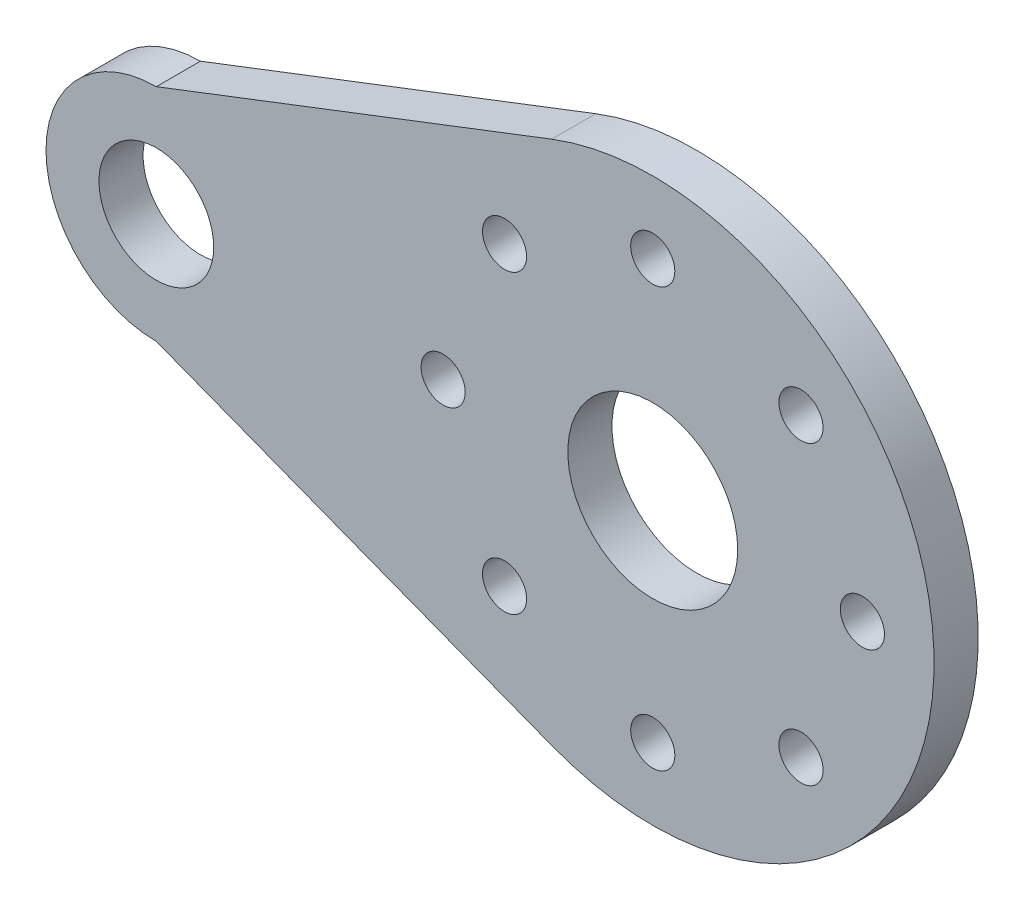
ISO-10303-21;
HEADER;
FILE_DESCRIPTION(('STEP AP214'),'2;1');
FILE_NAME('part.step','',(''),(''),'','','');
FILE_SCHEMA(('AUTOMOTIVE_DESIGN { 1 0 10303 214 1 1 1 1 }'));
ENDSEC;
DATA;
#1=APPLICATION_CONTEXT('core data for automotive mechanical design processes');
#2=APPLICATION_PROTOCOL_DEFINITION('international standard','automotive_design',2000,#1);
#3=PRODUCT_CONTEXT('',#1,'mechanical');
#4=PRODUCT('Part','Part','',(#3));
#5=PRODUCT_RELATED_PRODUCT_CATEGORY('part','',(#4));
#6=PRODUCT_DEFINITION_FORMATION('','',#4);
#7=PRODUCT_DEFINITION_CONTEXT('part definition',#1,'design');
#8=PRODUCT_DEFINITION('design','',#6,#7);
#9=PRODUCT_DEFINITION_SHAPE('','',#8);
#10=(LENGTH_UNIT() NAMED_UNIT(*) SI_UNIT(.MILLI.,.METRE.));
#11=(NAMED_UNIT(*) PLANE_ANGLE_UNIT() SI_UNIT($,.RADIAN.));
#12=(NAMED_UNIT(*) SI_UNIT($,.STERADIAN.) SOLID_ANGLE_UNIT());
#13=UNCERTAINTY_MEASURE_WITH_UNIT(LENGTH_MEASURE(1.E-05),#10,'distance_accuracy_value','');
#14=(GEOMETRIC_REPRESENTATION_CONTEXT(3) GLOBAL_UNCERTAINTY_ASSIGNED_CONTEXT((#13)) GLOBAL_UNIT_ASSIGNED_CONTEXT((#10,
#11,#12)) REPRESENTATION_CONTEXT('',''));
#15=CARTESIAN_POINT('',(0.,0.,0.));
#16=DIRECTION('',(0.,0.,1.));
#17=DIRECTION('',(1.,0.,0.));
#18=AXIS2_PLACEMENT_3D('',#15,#16,#17);
#19=CARTESIAN_POINT('',(95.4647726056997,-16.6382713176005,4.));
#20=DIRECTION('',(0.,0.,-1.));
#21=DIRECTION('',(-1.,0.,0.));
#22=AXIS2_PLACEMENT_3D('',#19,#20,#21);
#23=PLANE('',#22);
#24=CARTESIAN_POINT('',(95.4647726056997,-16.6382713176005,4.));
#25=DIRECTION('',(0.,0.,1.));
#26=DIRECTION('',(-1.,0.,0.));
#27=AXIS2_PLACEMENT_3D('',#24,#25,#26);
#28=CIRCLE('',#27,9.99999999999999);
#29=CARTESIAN_POINT('',(95.4647726056997,-6.63827131760054,4.));
#30=VERTEX_POINT('',#29);
#31=CARTESIAN_POINT('',(95.4647726056997,-26.6382713176005,4.));
#32=VERTEX_POINT('',#31);
#33=EDGE_CURVE('E92',#30,#32,#28,.T.);
#34=ORIENTED_EDGE('',*,*,#33,.T.);
#35=DIRECTION('',(0.9332288586066,-0.359282475865194,0.));
#36=VECTOR('',#35,1.);
#37=CARTESIAN_POINT('',(95.4647726056997,-26.6382713176005,4.));
#38=LINE('',#37,#36);
#39=CARTESIAN_POINT('',(131.303069471137,-40.4356072120686,4.));
#40=VERTEX_POINT('',#39);
#41=EDGE_CURVE('E87',#32,#40,#38,.T.);
#42=ORIENTED_EDGE('',*,*,#41,.T.);
#43=CARTESIAN_POINT('',(140.4647726057,-16.6382713176005,4.));
#44=DIRECTION('',(0.,0.,1.));
#45=DIRECTION('',(-1.,0.,0.));
#46=AXIS2_PLACEMENT_3D('',#43,#44,#45);
#47=CIRCLE('',#46,25.4999999999998);
#48=CARTESIAN_POINT('',(131.303069471137,7.15906457686749,4.));
#49=VERTEX_POINT('',#48);
#50=EDGE_CURVE('E90',#40,#49,#47,.T.);
#51=ORIENTED_EDGE('',*,*,#50,.T.);
#52=DIRECTION('',(-0.933228858606599,-0.359282475865194,0.));
#53=VECTOR('',#52,1.);
#54=CARTESIAN_POINT('',(95.4647726056997,-6.63827131760054,4.));
#55=LINE('',#54,#53);
#56=EDGE_CURVE('E57',#49,#30,#55,.T.);
#57=ORIENTED_EDGE('',*,*,#56,.T.);
#58=EDGE_LOOP('',(#34,#42,#51,#57));
#59=FACE_BOUND('',#58,.T.);
#60=CARTESIAN_POINT('',(140.4647726057,-35.6382713175993,4.));
#61=DIRECTION('',(0.,0.,1.));
#62=DIRECTION('',(1.,0.,0.));
#63=AXIS2_PLACEMENT_3D('',#60,#61,#62);
#64=CIRCLE('',#63,1.99999999999848);
#65=CARTESIAN_POINT('',(142.464772605698,-35.6382713175993,4.));
#66=VERTEX_POINT('',#65);
#67=EDGE_CURVE('E112',#66,#66,#64,.T.);
#68=ORIENTED_EDGE('',*,*,#67,.F.);
#69=EDGE_LOOP('',(#68));
#70=FACE_BOUND('',#69,.T.);
#71=CARTESIAN_POINT('',(140.4647726057,-16.6382713176005,4.));
#72=DIRECTION('',(0.,0.,1.));
#73=DIRECTION('',(1.,0.,0.));
#74=AXIS2_PLACEMENT_3D('',#71,#72,#73);
#75=CIRCLE('',#74,7.7);
#76=CARTESIAN_POINT('',(148.1647726057,-16.6382713176005,4.));
#77=VERTEX_POINT('',#76);
#78=EDGE_CURVE('E134',#77,#77,#75,.T.);
#79=ORIENTED_EDGE('',*,*,#78,.F.);
#80=EDGE_LOOP('',(#79));
#81=FACE_BOUND('',#80,.T.);
#82=CARTESIAN_POINT('',(127.029743763154,-30.0733001601467,4.));
#83=DIRECTION('',(0.,0.,1.));
#84=DIRECTION('',(1.,0.,0.));
#85=AXIS2_PLACEMENT_3D('',#82,#83,#84);
#86=CIRCLE('',#85,1.99999999999913);
#87=CARTESIAN_POINT('',(129.029743763153,-30.0733001601467,4.));
#88=VERTEX_POINT('',#87);
#89=EDGE_CURVE('E142',#88,#88,#86,.T.);
#90=ORIENTED_EDGE('',*,*,#89,.F.);
#91=EDGE_LOOP('',(#90));
#92=FACE_BOUND('',#91,.T.);
#93=CARTESIAN_POINT('',(121.464772605697,-16.6382713176019,4.));
#94=DIRECTION('',(0.,0.,1.));
#95=DIRECTION('',(1.,0.,0.));
#96=AXIS2_PLACEMENT_3D('',#93,#94,#95);
#97=CIRCLE('',#96,1.99999999999909);
#98=CARTESIAN_POINT('',(123.464772605696,-16.6382713176019,4.));
#99=VERTEX_POINT('',#98);
#100=EDGE_CURVE('E150',#99,#99,#97,.T.);
#101=ORIENTED_EDGE('',*,*,#100,.F.);
#102=EDGE_LOOP('',(#101));
#103=FACE_BOUND('',#102,.T.);
#104=CARTESIAN_POINT('',(127.029743763152,-3.20324247505635,4.));
#105=DIRECTION('',(0.,0.,1.));
#106=DIRECTION('',(1.,0.,0.));
#107=AXIS2_PLACEMENT_3D('',#104,#105,#106);
#108=CIRCLE('',#107,1.99999999999905);
#109=CARTESIAN_POINT('',(129.029743763151,-3.20324247505635,4.));
#110=VERTEX_POINT('',#109);
#111=EDGE_CURVE('E158',#110,#110,#108,.T.);
#112=ORIENTED_EDGE('',*,*,#111,.F.);
#113=EDGE_LOOP('',(#112));
#114=FACE_BOUND('',#113,.T.);
#115=CARTESIAN_POINT('',(95.4647726056997,-16.6382713176005,4.));
#116=DIRECTION('',(0.,0.,1.));
#117=DIRECTION('',(1.,0.,0.));
#118=AXIS2_PLACEMENT_3D('',#115,#116,#117);
#119=CIRCLE('',#118,5.19999999999999);
#120=CARTESIAN_POINT('',(100.6647726057,-16.6382713176005,4.));
#121=VERTEX_POINT('',#120);
#122=EDGE_CURVE('E166',#121,#121,#119,.T.);
#123=ORIENTED_EDGE('',*,*,#122,.F.);
#124=EDGE_LOOP('',(#123));
#125=FACE_BOUND('',#124,.T.);
#126=CARTESIAN_POINT('',(140.464772605697,2.36172868240044,4.));
#127=DIRECTION('',(0.,0.,1.));
#128=DIRECTION('',(1.,0.,0.));
#129=AXIS2_PLACEMENT_3D('',#126,#127,#128);
#130=CIRCLE('',#129,1.99999999999901);
#131=CARTESIAN_POINT('',(142.464772605696,2.36172868240044,4.));
#132=VERTEX_POINT('',#131);
#133=EDGE_CURVE('E174',#132,#132,#130,.T.);
#134=ORIENTED_EDGE('',*,*,#133,.F.);
#135=EDGE_LOOP('',(#134));
#136=FACE_BOUND('',#135,.T.);
#137=CARTESIAN_POINT('',(153.899801448243,-3.20324247505459,4.));
#138=DIRECTION('',(0.,0.,1.));
#139=DIRECTION('',(1.,0.,0.));
#140=AXIS2_PLACEMENT_3D('',#137,#138,#139);
#141=CIRCLE('',#140,1.99999999999897);
#142=CARTESIAN_POINT('',(155.899801448242,-3.20324247505459,4.));
#143=VERTEX_POINT('',#142);
#144=EDGE_CURVE('E182',#143,#143,#141,.T.);
#145=ORIENTED_EDGE('',*,*,#144,.F.);
#146=EDGE_LOOP('',(#145));
#147=FACE_BOUND('',#146,.T.);
#148=CARTESIAN_POINT('',(159.464772605699,-16.6382713175994,4.));
#149=DIRECTION('',(0.,0.,1.));
#150=DIRECTION('',(1.,0.,0.));
#151=AXIS2_PLACEMENT_3D('',#148,#149,#150);
#152=CIRCLE('',#151,1.99999999999895);
#153=CARTESIAN_POINT('',(161.464772605698,-16.6382713175994,4.));
#154=VERTEX_POINT('',#153);
#155=EDGE_CURVE('E190',#154,#154,#152,.T.);
#156=ORIENTED_EDGE('',*,*,#155,.F.);
#157=EDGE_LOOP('',(#156));
#158=FACE_BOUND('',#157,.T.);
#159=CARTESIAN_POINT('',(153.899801448244,-30.0733001601449,4.));
#160=DIRECTION('',(0.,0.,1.));
#161=DIRECTION('',(1.,0.,0.));
#162=AXIS2_PLACEMENT_3D('',#159,#160,#161);
#163=CIRCLE('',#162,1.99999999999894);
#164=CARTESIAN_POINT('',(155.899801448243,-30.0733001601449,4.));
#165=VERTEX_POINT('',#164);
#166=EDGE_CURVE('E198',#165,#165,#163,.T.);
#167=ORIENTED_EDGE('',*,*,#166,.F.);
#168=EDGE_LOOP('',(#167));
#169=FACE_BOUND('',#168,.T.);
#170=ADVANCED_FACE('F39',(#59,#70,#81,#92,#103,#114,#125,#136,#147,#158,#169),#23,.F.);
#171=CARTESIAN_POINT('',(95.4647726056997,-16.6382713176005,0.));
#172=DIRECTION('',(0.,0.,-1.));
#173=DIRECTION('',(-1.,0.,0.));
#174=AXIS2_PLACEMENT_3D('',#171,#172,#173);
#175=PLANE('',#174);
#176=CARTESIAN_POINT('',(159.464772605699,-16.6382713175994,0.));
#177=DIRECTION('',(0.,0.,1.));
#178=DIRECTION('',(1.,0.,0.));
#179=AXIS2_PLACEMENT_3D('',#176,#177,#178);
#180=CIRCLE('',#179,1.99999999999895);
#181=CARTESIAN_POINT('',(161.464772605698,-16.6382713175994,0.));
#182=VERTEX_POINT('',#181);
#183=EDGE_CURVE('E194',#182,#182,#180,.T.);
#184=ORIENTED_EDGE('',*,*,#183,.T.);
#185=EDGE_LOOP('',(#184));
#186=FACE_BOUND('',#185,.T.);
#187=CARTESIAN_POINT('',(140.464772605697,2.36172868240044,0.));
#188=DIRECTION('',(0.,0.,1.));
#189=DIRECTION('',(1.,0.,0.));
#190=AXIS2_PLACEMENT_3D('',#187,#188,#189);
#191=CIRCLE('',#190,1.99999999999901);
#192=CARTESIAN_POINT('',(142.464772605696,2.36172868240044,0.));
#193=VERTEX_POINT('',#192);
#194=EDGE_CURVE('E178',#193,#193,#191,.T.);
#195=ORIENTED_EDGE('',*,*,#194,.T.);
#196=EDGE_LOOP('',(#195));
#197=FACE_BOUND('',#196,.T.);
#198=CARTESIAN_POINT('',(127.029743763152,-3.20324247505635,0.));
#199=DIRECTION('',(0.,0.,1.));
#200=DIRECTION('',(1.,0.,0.));
#201=AXIS2_PLACEMENT_3D('',#198,#199,#200);
#202=CIRCLE('',#201,1.99999999999905);
#203=CARTESIAN_POINT('',(129.029743763151,-3.20324247505635,0.));
#204=VERTEX_POINT('',#203);
#205=EDGE_CURVE('E162',#204,#204,#202,.T.);
#206=ORIENTED_EDGE('',*,*,#205,.T.);
#207=EDGE_LOOP('',(#206));
#208=FACE_BOUND('',#207,.T.);
#209=CARTESIAN_POINT('',(127.029743763154,-30.0733001601467,0.));
#210=DIRECTION('',(0.,0.,1.));
#211=DIRECTION('',(1.,0.,0.));
#212=AXIS2_PLACEMENT_3D('',#209,#210,#211);
#213=CIRCLE('',#212,1.99999999999913);
#214=CARTESIAN_POINT('',(129.029743763153,-30.0733001601467,0.));
#215=VERTEX_POINT('',#214);
#216=EDGE_CURVE('E146',#215,#215,#213,.T.);
#217=ORIENTED_EDGE('',*,*,#216,.T.);
#218=EDGE_LOOP('',(#217));
#219=FACE_BOUND('',#218,.T.);
#220=CARTESIAN_POINT('',(140.4647726057,-35.6382713175993,0.));
#221=DIRECTION('',(0.,0.,1.));
#222=DIRECTION('',(1.,0.,0.));
#223=AXIS2_PLACEMENT_3D('',#220,#221,#222);
#224=CIRCLE('',#223,1.99999999999848);
#225=CARTESIAN_POINT('',(142.464772605698,-35.6382713175993,0.));
#226=VERTEX_POINT('',#225);
#227=EDGE_CURVE('E130',#226,#226,#224,.T.);
#228=ORIENTED_EDGE('',*,*,#227,.T.);
#229=EDGE_LOOP('',(#228));
#230=FACE_BOUND('',#229,.T.);
#231=CARTESIAN_POINT('',(95.4647726056997,-16.6382713176005,0.));
#232=DIRECTION('',(0.,0.,1.));
#233=DIRECTION('',(-1.,0.,0.));
#234=AXIS2_PLACEMENT_3D('',#231,#232,#233);
#235=CIRCLE('',#234,9.99999999999999);
#236=CARTESIAN_POINT('',(95.4647726056997,-6.63827131760054,0.));
#237=VERTEX_POINT('',#236);
#238=CARTESIAN_POINT('',(95.4647726056997,-26.6382713176005,0.));
#239=VERTEX_POINT('',#238);
#240=EDGE_CURVE('E108',#237,#239,#235,.T.);
#241=ORIENTED_EDGE('',*,*,#240,.F.);
#242=DIRECTION('',(-0.933228858606599,-0.359282475865194,0.));
#243=VECTOR('',#242,1.);
#244=CARTESIAN_POINT('',(95.4647726056997,-6.63827131760054,0.));
#245=LINE('',#244,#243);
#246=CARTESIAN_POINT('',(131.303069471137,7.15906457686749,0.));
#247=VERTEX_POINT('',#246);
#248=EDGE_CURVE('E80',#247,#237,#245,.T.);
#249=ORIENTED_EDGE('',*,*,#248,.F.);
#250=CARTESIAN_POINT('',(140.4647726057,-16.6382713176005,0.));
#251=DIRECTION('',(0.,0.,1.));
#252=DIRECTION('',(-1.,0.,0.));
#253=AXIS2_PLACEMENT_3D('',#250,#251,#252);
#254=CIRCLE('',#253,25.4999999999998);
#255=CARTESIAN_POINT('',(131.303069471137,-40.4356072120686,0.));
#256=VERTEX_POINT('',#255);
#257=EDGE_CURVE('E74',#256,#247,#254,.T.);
#258=ORIENTED_EDGE('',*,*,#257,.F.);
#259=DIRECTION('',(0.9332288586066,-0.359282475865194,0.));
#260=VECTOR('',#259,1.);
#261=CARTESIAN_POINT('',(95.4647726056997,-26.6382713176005,0.));
#262=LINE('',#261,#260);
#263=EDGE_CURVE('E97',#239,#256,#262,.T.);
#264=ORIENTED_EDGE('',*,*,#263,.F.);
#265=EDGE_LOOP('',(#241,#249,#258,#264));
#266=FACE_BOUND('',#265,.T.);
#267=CARTESIAN_POINT('',(140.4647726057,-16.6382713176005,0.));
#268=DIRECTION('',(0.,0.,1.));
#269=DIRECTION('',(1.,0.,0.));
#270=AXIS2_PLACEMENT_3D('',#267,#268,#269);
#271=CIRCLE('',#270,7.7);
#272=CARTESIAN_POINT('',(148.1647726057,-16.6382713176005,0.));
#273=VERTEX_POINT('',#272);
#274=EDGE_CURVE('E138',#273,#273,#271,.T.);
#275=ORIENTED_EDGE('',*,*,#274,.T.);
#276=EDGE_LOOP('',(#275));
#277=FACE_BOUND('',#276,.T.);
#278=CARTESIAN_POINT('',(121.464772605697,-16.6382713176019,0.));
#279=DIRECTION('',(0.,0.,1.));
#280=DIRECTION('',(1.,0.,0.));
#281=AXIS2_PLACEMENT_3D('',#278,#279,#280);
#282=CIRCLE('',#281,1.99999999999909);
#283=CARTESIAN_POINT('',(123.464772605696,-16.6382713176019,0.));
#284=VERTEX_POINT('',#283);
#285=EDGE_CURVE('E154',#284,#284,#282,.T.);
#286=ORIENTED_EDGE('',*,*,#285,.T.);
#287=EDGE_LOOP('',(#286));
#288=FACE_BOUND('',#287,.T.);
#289=CARTESIAN_POINT('',(95.4647726056997,-16.6382713176005,0.));
#290=DIRECTION('',(0.,0.,1.));
#291=DIRECTION('',(1.,0.,0.));
#292=AXIS2_PLACEMENT_3D('',#289,#290,#291);
#293=CIRCLE('',#292,5.19999999999999);
#294=CARTESIAN_POINT('',(100.6647726057,-16.6382713176005,0.));
#295=VERTEX_POINT('',#294);
#296=EDGE_CURVE('E170',#295,#295,#293,.T.);
#297=ORIENTED_EDGE('',*,*,#296,.T.);
#298=EDGE_LOOP('',(#297));
#299=FACE_BOUND('',#298,.T.);
#300=CARTESIAN_POINT('',(153.899801448243,-3.20324247505459,0.));
#301=DIRECTION('',(0.,0.,1.));
#302=DIRECTION('',(1.,0.,0.));
#303=AXIS2_PLACEMENT_3D('',#300,#301,#302);
#304=CIRCLE('',#303,1.99999999999897);
#305=CARTESIAN_POINT('',(155.899801448242,-3.20324247505459,0.));
#306=VERTEX_POINT('',#305);
#307=EDGE_CURVE('E186',#306,#306,#304,.T.);
#308=ORIENTED_EDGE('',*,*,#307,.T.);
#309=EDGE_LOOP('',(#308));
#310=FACE_BOUND('',#309,.T.);
#311=CARTESIAN_POINT('',(153.899801448244,-30.0733001601449,0.));
#312=DIRECTION('',(0.,0.,1.));
#313=DIRECTION('',(1.,0.,0.));
#314=AXIS2_PLACEMENT_3D('',#311,#312,#313);
#315=CIRCLE('',#314,1.99999999999894);
#316=CARTESIAN_POINT('',(155.899801448243,-30.0733001601449,0.));
#317=VERTEX_POINT('',#316);
#318=EDGE_CURVE('E202',#317,#317,#315,.T.);
#319=ORIENTED_EDGE('',*,*,#318,.T.);
#320=EDGE_LOOP('',(#319));
#321=FACE_BOUND('',#320,.T.);
#322=ADVANCED_FACE('F125',(#186,#197,#208,#219,#230,#266,#277,#288,#299,#310,#321),#175,.T.);
#323=CARTESIAN_POINT('',(95.4647726056997,-16.6382713176005,4.));
#324=DIRECTION('',(0.,0.,-1.));
#325=DIRECTION('',(-1.,0.,0.));
#326=AXIS2_PLACEMENT_3D('',#323,#324,#325);
#327=CYLINDRICAL_SURFACE('',#326,9.99999999999999);
#328=ORIENTED_EDGE('',*,*,#240,.T.);
#329=DIRECTION('',(0.,0.,-1.));
#330=VECTOR('',#329,1.);
#331=CARTESIAN_POINT('',(95.4647726056997,-26.6382713176005,4.));
#332=LINE('',#331,#330);
#333=EDGE_CURVE('E11',#32,#239,#332,.T.);
#334=ORIENTED_EDGE('',*,*,#333,.F.);
#335=ORIENTED_EDGE('',*,*,#33,.F.);
#336=DIRECTION('',(0.,0.,-1.));
#337=VECTOR('',#336,1.);
#338=CARTESIAN_POINT('',(95.4647726056997,-6.63827131760054,4.));
#339=LINE('',#338,#337);
#340=EDGE_CURVE('E104',#30,#237,#339,.T.);
#341=ORIENTED_EDGE('',*,*,#340,.T.);
#342=EDGE_LOOP('',(#328,#334,#335,#341));
#343=FACE_BOUND('',#342,.T.);
#344=ADVANCED_FACE('F41',(#343),#327,.T.);
#345=CARTESIAN_POINT('',(95.4647726056997,-26.6382713176005,4.));
#346=DIRECTION('',(0.359282475865194,0.933228858606599,0.));
#347=DIRECTION('',(-0.9332288586066,0.359282475865194,0.));
#348=AXIS2_PLACEMENT_3D('',#345,#346,#347);
#349=PLANE('',#348);
#350=ORIENTED_EDGE('',*,*,#263,.T.);
#351=DIRECTION('',(0.,0.,-1.));
#352=VECTOR('',#351,1.);
#353=CARTESIAN_POINT('',(131.303069471137,-40.4356072120686,4.));
#354=LINE('',#353,#352);
#355=EDGE_CURVE('E49',#40,#256,#354,.T.);
#356=ORIENTED_EDGE('',*,*,#355,.F.);
#357=ORIENTED_EDGE('',*,*,#41,.F.);
#358=ORIENTED_EDGE('',*,*,#333,.T.);
#359=EDGE_LOOP('',(#350,#356,#357,#358));
#360=FACE_BOUND('',#359,.T.);
#361=ADVANCED_FACE('F96',(#360),#349,.F.);
#362=CARTESIAN_POINT('',(140.4647726057,-16.6382713176005,4.));
#363=DIRECTION('',(0.,0.,-1.));
#364=DIRECTION('',(-1.,0.,0.));
#365=AXIS2_PLACEMENT_3D('',#362,#363,#364);
#366=CYLINDRICAL_SURFACE('',#365,25.4999999999998);
#367=ORIENTED_EDGE('',*,*,#257,.T.);
#368=DIRECTION('',(0.,0.,-1.));
#369=VECTOR('',#368,1.);
#370=CARTESIAN_POINT('',(131.303069471137,7.15906457686749,4.));
#371=LINE('',#370,#369);
#372=EDGE_CURVE('E99',#49,#247,#371,.T.);
#373=ORIENTED_EDGE('',*,*,#372,.F.);
#374=ORIENTED_EDGE('',*,*,#50,.F.);
#375=ORIENTED_EDGE('',*,*,#355,.T.);
#376=EDGE_LOOP('',(#367,#373,#374,#375));
#377=FACE_BOUND('',#376,.T.);
#378=ADVANCED_FACE('F100',(#377),#366,.T.);
#379=CARTESIAN_POINT('',(95.4647726056997,-6.63827131760054,4.));
#380=DIRECTION('',(0.359282475865194,-0.933228858606599,0.));
#381=DIRECTION('',(0.9332288586066,0.359282475865194,0.));
#382=AXIS2_PLACEMENT_3D('',#379,#380,#381);
#383=PLANE('',#382);
#384=ORIENTED_EDGE('',*,*,#248,.T.);
#385=ORIENTED_EDGE('',*,*,#340,.F.);
#386=ORIENTED_EDGE('',*,*,#56,.F.);
#387=ORIENTED_EDGE('',*,*,#372,.T.);
#388=EDGE_LOOP('',(#384,#385,#386,#387));
#389=FACE_BOUND('',#388,.T.);
#390=ADVANCED_FACE('F122',(#389),#383,.F.);
#391=CARTESIAN_POINT('',(140.4647726057,-35.6382713175993,4.));
#392=DIRECTION('',(0.,0.,-1.));
#393=DIRECTION('',(-1.,0.,0.));
#394=AXIS2_PLACEMENT_3D('',#391,#392,#393);
#395=CYLINDRICAL_SURFACE('',#394,1.99999999999848);
#396=ORIENTED_EDGE('',*,*,#67,.T.);
#397=EDGE_LOOP('',(#396));
#398=FACE_BOUND('',#397,.T.);
#399=ORIENTED_EDGE('',*,*,#227,.F.);
#400=EDGE_LOOP('',(#399));
#401=FACE_BOUND('',#400,.T.);
#402=ADVANCED_FACE('F221',(#398,#401),#395,.F.);
#403=CARTESIAN_POINT('',(140.4647726057,-16.6382713176005,4.));
#404=DIRECTION('',(0.,0.,-1.));
#405=DIRECTION('',(-1.,0.,0.));
#406=AXIS2_PLACEMENT_3D('',#403,#404,#405);
#407=CYLINDRICAL_SURFACE('',#406,7.7);
#408=ORIENTED_EDGE('',*,*,#78,.T.);
#409=EDGE_LOOP('',(#408));
#410=FACE_BOUND('',#409,.T.);
#411=ORIENTED_EDGE('',*,*,#274,.F.);
#412=EDGE_LOOP('',(#411));
#413=FACE_BOUND('',#412,.T.);
#414=ADVANCED_FACE('F267',(#410,#413),#407,.F.);
#415=CARTESIAN_POINT('',(127.029743763154,-30.0733001601467,4.));
#416=DIRECTION('',(0.,0.,-1.));
#417=DIRECTION('',(-1.,0.,0.));
#418=AXIS2_PLACEMENT_3D('',#415,#416,#417);
#419=CYLINDRICAL_SURFACE('',#418,1.99999999999913);
#420=ORIENTED_EDGE('',*,*,#89,.T.);
#421=EDGE_LOOP('',(#420));
#422=FACE_BOUND('',#421,.T.);
#423=ORIENTED_EDGE('',*,*,#216,.F.);
#424=EDGE_LOOP('',(#423));
#425=FACE_BOUND('',#424,.T.);
#426=ADVANCED_FACE('F275',(#422,#425),#419,.F.);
#427=CARTESIAN_POINT('',(121.464772605697,-16.6382713176019,4.));
#428=DIRECTION('',(0.,0.,-1.));
#429=DIRECTION('',(-1.,0.,0.));
#430=AXIS2_PLACEMENT_3D('',#427,#428,#429);
#431=CYLINDRICAL_SURFACE('',#430,1.99999999999909);
#432=ORIENTED_EDGE('',*,*,#100,.T.);
#433=EDGE_LOOP('',(#432));
#434=FACE_BOUND('',#433,.T.);
#435=ORIENTED_EDGE('',*,*,#285,.F.);
#436=EDGE_LOOP('',(#435));
#437=FACE_BOUND('',#436,.T.);
#438=ADVANCED_FACE('F283',(#434,#437),#431,.F.);
#439=CARTESIAN_POINT('',(127.029743763152,-3.20324247505635,4.));
#440=DIRECTION('',(0.,0.,-1.));
#441=DIRECTION('',(-1.,0.,0.));
#442=AXIS2_PLACEMENT_3D('',#439,#440,#441);
#443=CYLINDRICAL_SURFACE('',#442,1.99999999999905);
#444=ORIENTED_EDGE('',*,*,#111,.T.);
#445=EDGE_LOOP('',(#444));
#446=FACE_BOUND('',#445,.T.);
#447=ORIENTED_EDGE('',*,*,#205,.F.);
#448=EDGE_LOOP('',(#447));
#449=FACE_BOUND('',#448,.T.);
#450=ADVANCED_FACE('F292',(#446,#449),#443,.F.);
#451=CARTESIAN_POINT('',(95.4647726056997,-16.6382713176005,4.));
#452=DIRECTION('',(0.,0.,-1.));
#453=DIRECTION('',(-1.,0.,0.));
#454=AXIS2_PLACEMENT_3D('',#451,#452,#453);
#455=CYLINDRICAL_SURFACE('',#454,5.19999999999999);
#456=ORIENTED_EDGE('',*,*,#122,.T.);
#457=EDGE_LOOP('',(#456));
#458=FACE_BOUND('',#457,.T.);
#459=ORIENTED_EDGE('',*,*,#296,.F.);
#460=EDGE_LOOP('',(#459));
#461=FACE_BOUND('',#460,.T.);
#462=ADVANCED_FACE('F301',(#458,#461),#455,.F.);
#463=CARTESIAN_POINT('',(140.464772605697,2.36172868240044,4.));
#464=DIRECTION('',(0.,0.,-1.));
#465=DIRECTION('',(-1.,0.,0.));
#466=AXIS2_PLACEMENT_3D('',#463,#464,#465);
#467=CYLINDRICAL_SURFACE('',#466,1.99999999999901);
#468=ORIENTED_EDGE('',*,*,#133,.T.);
#469=EDGE_LOOP('',(#468));
#470=FACE_BOUND('',#469,.T.);
#471=ORIENTED_EDGE('',*,*,#194,.F.);
#472=EDGE_LOOP('',(#471));
#473=FACE_BOUND('',#472,.T.);
#474=ADVANCED_FACE('F310',(#470,#473),#467,.F.);
#475=CARTESIAN_POINT('',(153.899801448243,-3.20324247505459,4.));
#476=DIRECTION('',(0.,0.,-1.));
#477=DIRECTION('',(-1.,0.,0.));
#478=AXIS2_PLACEMENT_3D('',#475,#476,#477);
#479=CYLINDRICAL_SURFACE('',#478,1.99999999999897);
#480=ORIENTED_EDGE('',*,*,#144,.T.);
#481=EDGE_LOOP('',(#480));
#482=FACE_BOUND('',#481,.T.);
#483=ORIENTED_EDGE('',*,*,#307,.F.);
#484=EDGE_LOOP('',(#483));
#485=FACE_BOUND('',#484,.T.);
#486=ADVANCED_FACE('F319',(#482,#485),#479,.F.);
#487=CARTESIAN_POINT('',(159.464772605699,-16.6382713175994,4.));
#488=DIRECTION('',(0.,0.,-1.));
#489=DIRECTION('',(-1.,0.,0.));
#490=AXIS2_PLACEMENT_3D('',#487,#488,#489);
#491=CYLINDRICAL_SURFACE('',#490,1.99999999999895);
#492=ORIENTED_EDGE('',*,*,#155,.T.);
#493=EDGE_LOOP('',(#492));
#494=FACE_BOUND('',#493,.T.);
#495=ORIENTED_EDGE('',*,*,#183,.F.);
#496=EDGE_LOOP('',(#495));
#497=FACE_BOUND('',#496,.T.);
#498=ADVANCED_FACE('F328',(#494,#497),#491,.F.);
#499=CARTESIAN_POINT('',(153.899801448244,-30.0733001601449,4.));
#500=DIRECTION('',(0.,0.,-1.));
#501=DIRECTION('',(-1.,0.,0.));
#502=AXIS2_PLACEMENT_3D('',#499,#500,#501);
#503=CYLINDRICAL_SURFACE('',#502,1.99999999999894);
#504=ORIENTED_EDGE('',*,*,#166,.T.);
#505=EDGE_LOOP('',(#504));
#506=FACE_BOUND('',#505,.T.);
#507=ORIENTED_EDGE('',*,*,#318,.F.);
#508=EDGE_LOOP('',(#507));
#509=FACE_BOUND('',#508,.T.);
#510=ADVANCED_FACE('F210',(#506,#509),#503,.F.);
#511=CLOSED_SHELL('',(#170,#322,#344,#361,#378,#390,#402,#414,#426,#438,#450,#462,#474,#486,
#498,#510));
#512=MANIFOLD_SOLID_BREP('B2',#511);
#513=ADVANCED_BREP_SHAPE_REPRESENTATION('',(#18,#512),#14);
#514=SHAPE_DEFINITION_REPRESENTATION(#9,#513);
ENDSEC;
END-ISO-10303-21;
